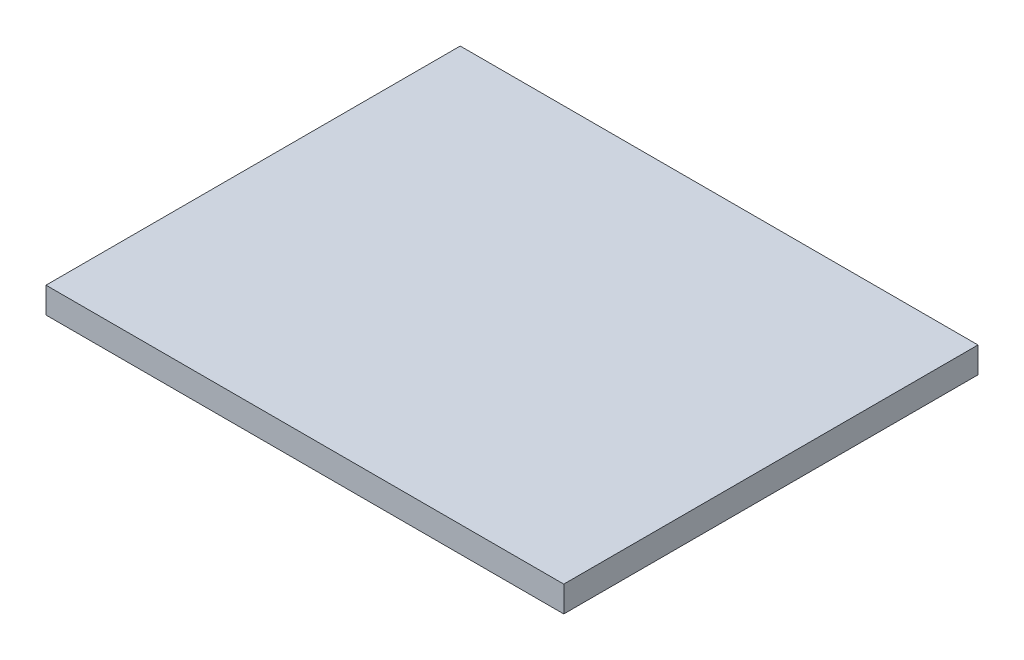
ISO-10303-21;
HEADER;
FILE_DESCRIPTION(('STEP AP214'),'2;1');
FILE_NAME('part.step','',(''),(''),'','','');
FILE_SCHEMA(('AUTOMOTIVE_DESIGN { 1 0 10303 214 1 1 1 1 }'));
ENDSEC;
DATA;
#1=APPLICATION_CONTEXT('core data for automotive mechanical design processes');
#2=APPLICATION_PROTOCOL_DEFINITION('international standard','automotive_design',2000,#1);
#3=PRODUCT_CONTEXT('',#1,'mechanical');
#4=PRODUCT('Part','Part','',(#3));
#5=PRODUCT_RELATED_PRODUCT_CATEGORY('part','',(#4));
#6=PRODUCT_DEFINITION_FORMATION('','',#4);
#7=PRODUCT_DEFINITION_CONTEXT('part definition',#1,'design');
#8=PRODUCT_DEFINITION('design','',#6,#7);
#9=PRODUCT_DEFINITION_SHAPE('','',#8);
#10=(LENGTH_UNIT() NAMED_UNIT(*) SI_UNIT(.MILLI.,.METRE.));
#11=(NAMED_UNIT(*) PLANE_ANGLE_UNIT() SI_UNIT($,.RADIAN.));
#12=(NAMED_UNIT(*) SI_UNIT($,.STERADIAN.) SOLID_ANGLE_UNIT());
#13=UNCERTAINTY_MEASURE_WITH_UNIT(LENGTH_MEASURE(1.E-05),#10,'distance_accuracy_value','');
#14=(GEOMETRIC_REPRESENTATION_CONTEXT(3) GLOBAL_UNCERTAINTY_ASSIGNED_CONTEXT((#13)) GLOBAL_UNIT_ASSIGNED_CONTEXT((#10,
#11,#12)) REPRESENTATION_CONTEXT('',''));
#15=CARTESIAN_POINT('',(0.,0.,0.));
#16=DIRECTION('',(0.,0.,1.));
#17=DIRECTION('',(1.,0.,0.));
#18=AXIS2_PLACEMENT_3D('',#15,#16,#17);
#19=CARTESIAN_POINT('',(-1.,0.1,-0.8));
#20=DIRECTION('',(1.,0.,0.));
#21=DIRECTION('',(0.,0.,-1.));
#22=AXIS2_PLACEMENT_3D('',#19,#20,#21);
#23=PLANE('',#22);
#24=DIRECTION('',(0.,0.,1.));
#25=VECTOR('',#24,1.);
#26=CARTESIAN_POINT('',(-1.,0.,-0.8));
#27=LINE('',#26,#25);
#28=CARTESIAN_POINT('',(-1.,0.,-0.8));
#29=VERTEX_POINT('',#28);
#30=CARTESIAN_POINT('',(-1.,0.,0.8));
#31=VERTEX_POINT('',#30);
#32=EDGE_CURVE('E98',#29,#31,#27,.T.);
#33=ORIENTED_EDGE('',*,*,#32,.T.);
#34=DIRECTION('',(0.,-1.,0.));
#35=VECTOR('',#34,1.);
#36=CARTESIAN_POINT('',(-1.,0.1,0.8));
#37=LINE('',#36,#35);
#38=CARTESIAN_POINT('',(-1.,0.1,0.8));
#39=VERTEX_POINT('',#38);
#40=EDGE_CURVE('E11',#39,#31,#37,.T.);
#41=ORIENTED_EDGE('',*,*,#40,.F.);
#42=DIRECTION('',(0.,0.,1.));
#43=VECTOR('',#42,1.);
#44=CARTESIAN_POINT('',(-1.,0.1,-0.8));
#45=LINE('',#44,#43);
#46=CARTESIAN_POINT('',(-1.,0.1,-0.8));
#47=VERTEX_POINT('',#46);
#48=EDGE_CURVE('E86',#47,#39,#45,.T.);
#49=ORIENTED_EDGE('',*,*,#48,.F.);
#50=DIRECTION('',(0.,-1.,0.));
#51=VECTOR('',#50,1.);
#52=CARTESIAN_POINT('',(-1.,0.1,-0.8));
#53=LINE('',#52,#51);
#54=EDGE_CURVE('E94',#47,#29,#53,.T.);
#55=ORIENTED_EDGE('',*,*,#54,.T.);
#56=EDGE_LOOP('',(#33,#41,#49,#55));
#57=FACE_BOUND('',#56,.T.);
#58=ADVANCED_FACE('F35',(#57),#23,.F.);
#59=CARTESIAN_POINT('',(1.,0.1,0.8));
#60=DIRECTION('',(0.,0.,-1.));
#61=DIRECTION('',(-1.,0.,0.));
#62=AXIS2_PLACEMENT_3D('',#59,#60,#61);
#63=PLANE('',#62);
#64=DIRECTION('',(1.,0.,0.));
#65=VECTOR('',#64,1.);
#66=CARTESIAN_POINT('',(1.,0.,0.8));
#67=LINE('',#66,#65);
#68=CARTESIAN_POINT('',(1.,0.,0.8));
#69=VERTEX_POINT('',#68);
#70=EDGE_CURVE('E90',#31,#69,#67,.T.);
#71=ORIENTED_EDGE('',*,*,#70,.T.);
#72=DIRECTION('',(0.,-1.,0.));
#73=VECTOR('',#72,1.);
#74=CARTESIAN_POINT('',(1.,0.1,0.8));
#75=LINE('',#74,#73);
#76=CARTESIAN_POINT('',(1.,0.1,0.8));
#77=VERTEX_POINT('',#76);
#78=EDGE_CURVE('E43',#77,#69,#75,.T.);
#79=ORIENTED_EDGE('',*,*,#78,.F.);
#80=DIRECTION('',(1.,0.,0.));
#81=VECTOR('',#80,1.);
#82=CARTESIAN_POINT('',(1.,0.1,0.8));
#83=LINE('',#82,#81);
#84=EDGE_CURVE('E81',#39,#77,#83,.T.);
#85=ORIENTED_EDGE('',*,*,#84,.F.);
#86=ORIENTED_EDGE('',*,*,#40,.T.);
#87=EDGE_LOOP('',(#71,#79,#85,#86));
#88=FACE_BOUND('',#87,.T.);
#89=ADVANCED_FACE('F89',(#88),#63,.F.);
#90=CARTESIAN_POINT('',(1.,0.1,-0.8));
#91=DIRECTION('',(-1.,0.,0.));
#92=DIRECTION('',(0.,0.,1.));
#93=AXIS2_PLACEMENT_3D('',#90,#91,#92);
#94=PLANE('',#93);
#95=DIRECTION('',(0.,0.,-1.));
#96=VECTOR('',#95,1.);
#97=CARTESIAN_POINT('',(1.,0.,-0.8));
#98=LINE('',#97,#96);
#99=CARTESIAN_POINT('',(1.,0.,-0.8));
#100=VERTEX_POINT('',#99);
#101=EDGE_CURVE('E68',#69,#100,#98,.T.);
#102=ORIENTED_EDGE('',*,*,#101,.T.);
#103=DIRECTION('',(0.,-1.,0.));
#104=VECTOR('',#103,1.);
#105=CARTESIAN_POINT('',(1.,0.1,-0.8));
#106=LINE('',#105,#104);
#107=CARTESIAN_POINT('',(1.,0.1,-0.8));
#108=VERTEX_POINT('',#107);
#109=EDGE_CURVE('E91',#108,#100,#106,.T.);
#110=ORIENTED_EDGE('',*,*,#109,.F.);
#111=DIRECTION('',(0.,0.,-1.));
#112=VECTOR('',#111,1.);
#113=CARTESIAN_POINT('',(1.,0.1,-0.8));
#114=LINE('',#113,#112);
#115=EDGE_CURVE('E84',#77,#108,#114,.T.);
#116=ORIENTED_EDGE('',*,*,#115,.F.);
#117=ORIENTED_EDGE('',*,*,#78,.T.);
#118=EDGE_LOOP('',(#102,#110,#116,#117));
#119=FACE_BOUND('',#118,.T.);
#120=ADVANCED_FACE('F92',(#119),#94,.F.);
#121=CARTESIAN_POINT('',(1.,0.1,-0.8));
#122=DIRECTION('',(0.,0.,1.));
#123=DIRECTION('',(1.,0.,0.));
#124=AXIS2_PLACEMENT_3D('',#121,#122,#123);
#125=PLANE('',#124);
#126=DIRECTION('',(-1.,0.,0.));
#127=VECTOR('',#126,1.);
#128=CARTESIAN_POINT('',(1.,0.,-0.8));
#129=LINE('',#128,#127);
#130=EDGE_CURVE('E74',#100,#29,#129,.T.);
#131=ORIENTED_EDGE('',*,*,#130,.T.);
#132=ORIENTED_EDGE('',*,*,#54,.F.);
#133=DIRECTION('',(-1.,0.,0.));
#134=VECTOR('',#133,1.);
#135=CARTESIAN_POINT('',(1.,0.1,-0.8));
#136=LINE('',#135,#134);
#137=EDGE_CURVE('E51',#108,#47,#136,.T.);
#138=ORIENTED_EDGE('',*,*,#137,.F.);
#139=ORIENTED_EDGE('',*,*,#109,.T.);
#140=EDGE_LOOP('',(#131,#132,#138,#139));
#141=FACE_BOUND('',#140,.T.);
#142=ADVANCED_FACE('F105',(#141),#125,.F.);
#143=CARTESIAN_POINT('',(0.,0.1,0.));
#144=DIRECTION('',(0.,-1.,0.));
#145=DIRECTION('',(0.,0.,-1.));
#146=AXIS2_PLACEMENT_3D('',#143,#144,#145);
#147=PLANE('',#146);
#148=ORIENTED_EDGE('',*,*,#48,.T.);
#149=ORIENTED_EDGE('',*,*,#84,.T.);
#150=ORIENTED_EDGE('',*,*,#115,.T.);
#151=ORIENTED_EDGE('',*,*,#137,.T.);
#152=EDGE_LOOP('',(#148,#149,#150,#151));
#153=FACE_BOUND('',#152,.T.);
#154=ADVANCED_FACE('F82',(#153),#147,.F.);
#155=CARTESIAN_POINT('',(0.,0.,0.));
#156=DIRECTION('',(0.,-1.,0.));
#157=DIRECTION('',(0.,0.,-1.));
#158=AXIS2_PLACEMENT_3D('',#155,#156,#157);
#159=PLANE('',#158);
#160=ORIENTED_EDGE('',*,*,#32,.F.);
#161=ORIENTED_EDGE('',*,*,#130,.F.);
#162=ORIENTED_EDGE('',*,*,#101,.F.);
#163=ORIENTED_EDGE('',*,*,#70,.F.);
#164=EDGE_LOOP('',(#160,#161,#162,#163));
#165=FACE_BOUND('',#164,.T.);
#166=ADVANCED_FACE('F108',(#165),#159,.T.);
#167=CLOSED_SHELL('',(#58,#89,#120,#142,#154,#166));
#168=MANIFOLD_SOLID_BREP('B2',#167);
#169=ADVANCED_BREP_SHAPE_REPRESENTATION('',(#18,#168),#14);
#170=SHAPE_DEFINITION_REPRESENTATION(#9,#169);
ENDSEC;
END-ISO-10303-21;
